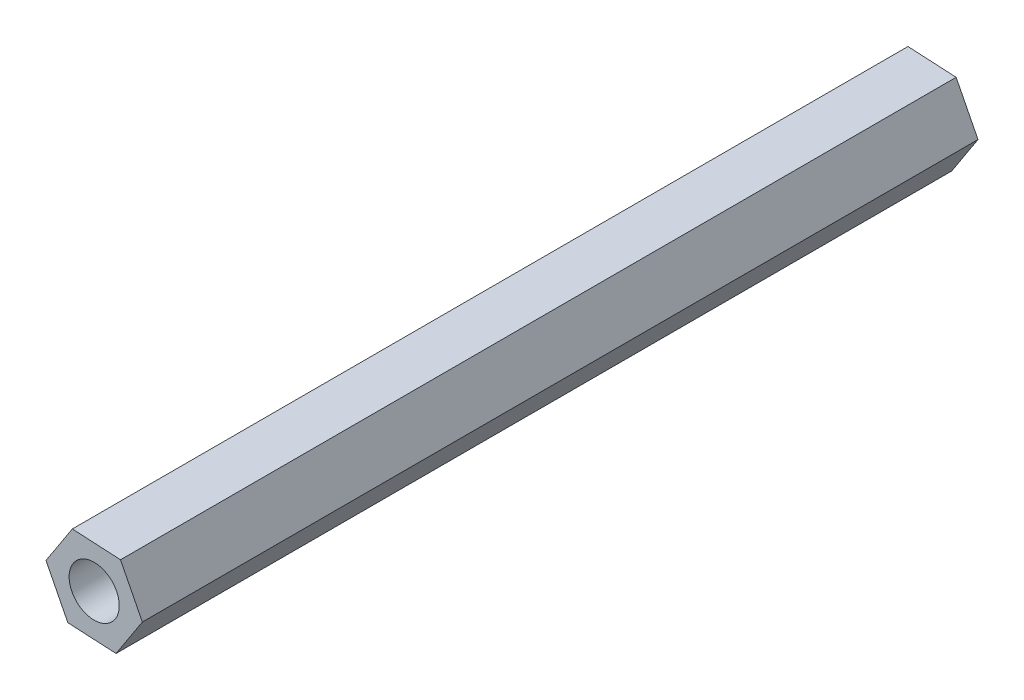
ISO-10303-21;
HEADER;
FILE_DESCRIPTION(('STEP AP214'),'2;1');
FILE_NAME('part.step','',(''),(''),'','','');
FILE_SCHEMA(('AUTOMOTIVE_DESIGN { 1 0 10303 214 1 1 1 1 }'));
ENDSEC;
DATA;
#1=APPLICATION_CONTEXT('core data for automotive mechanical design processes');
#2=APPLICATION_PROTOCOL_DEFINITION('international standard','automotive_design',2000,#1);
#3=PRODUCT_CONTEXT('',#1,'mechanical');
#4=PRODUCT('Part','Part','',(#3));
#5=PRODUCT_RELATED_PRODUCT_CATEGORY('part','',(#4));
#6=PRODUCT_DEFINITION_FORMATION('','',#4);
#7=PRODUCT_DEFINITION_CONTEXT('part definition',#1,'design');
#8=PRODUCT_DEFINITION('design','',#6,#7);
#9=PRODUCT_DEFINITION_SHAPE('','',#8);
#10=(LENGTH_UNIT() NAMED_UNIT(*) SI_UNIT(.MILLI.,.METRE.));
#11=(NAMED_UNIT(*) PLANE_ANGLE_UNIT() SI_UNIT($,.RADIAN.));
#12=(NAMED_UNIT(*) SI_UNIT($,.STERADIAN.) SOLID_ANGLE_UNIT());
#13=UNCERTAINTY_MEASURE_WITH_UNIT(LENGTH_MEASURE(1.E-05),#10,'distance_accuracy_value','');
#14=(GEOMETRIC_REPRESENTATION_CONTEXT(3) GLOBAL_UNCERTAINTY_ASSIGNED_CONTEXT((#13)) GLOBAL_UNIT_ASSIGNED_CONTEXT((#10,
#11,#12)) REPRESENTATION_CONTEXT('',''));
#15=CARTESIAN_POINT('',(0.,0.,0.));
#16=DIRECTION('',(0.,0.,1.));
#17=DIRECTION('',(1.,0.,0.));
#18=AXIS2_PLACEMENT_3D('',#15,#16,#17);
#19=CARTESIAN_POINT('',(2.8825916016709,-0.154916078280261,50.));
#20=DIRECTION('',(-0.891609732350342,-0.452804687672456,0.));
#21=DIRECTION('',(0.452804687672456,-0.891609732350342,0.));
#22=AXIS2_PLACEMENT_3D('',#19,#20,#21);
#23=PLANE('',#22);
#24=DIRECTION('',(-0.452804687672456,0.891609732350342,0.));
#25=VECTOR('',#24,1.);
#26=CARTESIAN_POINT('',(2.8825916016709,-0.154916078280261,0.));
#27=LINE('',#26,#25);
#28=CARTESIAN_POINT('',(2.8825916016709,-0.154916078280261,0.));
#29=VERTEX_POINT('',#28);
#30=CARTESIAN_POINT('',(1.57545706008081,2.41893951664254,0.));
#31=VERTEX_POINT('',#30);
#32=EDGE_CURVE('E116',#29,#31,#27,.T.);
#33=ORIENTED_EDGE('',*,*,#32,.T.);
#34=DIRECTION('',(0.,0.,-1.));
#35=VECTOR('',#34,1.);
#36=CARTESIAN_POINT('',(1.57545706008081,2.41893951664254,50.));
#37=LINE('',#36,#35);
#38=CARTESIAN_POINT('',(1.57545706008081,2.41893951664254,50.));
#39=VERTEX_POINT('',#38);
#40=EDGE_CURVE('E11',#39,#31,#37,.T.);
#41=ORIENTED_EDGE('',*,*,#40,.F.);
#42=DIRECTION('',(-0.452804687672456,0.891609732350342,0.));
#43=VECTOR('',#42,1.);
#44=CARTESIAN_POINT('',(2.8825916016709,-0.154916078280261,50.));
#45=LINE('',#44,#43);
#46=CARTESIAN_POINT('',(2.8825916016709,-0.154916078280261,50.));
#47=VERTEX_POINT('',#46);
#48=EDGE_CURVE('E127',#47,#39,#45,.T.);
#49=ORIENTED_EDGE('',*,*,#48,.F.);
#50=DIRECTION('',(0.,0.,-1.));
#51=VECTOR('',#50,1.);
#52=CARTESIAN_POINT('',(2.8825916016709,-0.154916078280261,50.));
#53=LINE('',#52,#51);
#54=EDGE_CURVE('E112',#47,#29,#53,.T.);
#55=ORIENTED_EDGE('',*,*,#54,.T.);
#56=EDGE_LOOP('',(#33,#41,#49,#55));
#57=FACE_BOUND('',#56,.T.);
#58=ADVANCED_FACE('F32',(#57),#23,.F.);
#59=CARTESIAN_POINT('',(1.57545706008081,2.41893951664254,50.));
#60=DIRECTION('',(-0.0536645036981452,-0.998559022313069,0.));
#61=DIRECTION('',(0.998559022313069,-0.0536645036981453,0.));
#62=AXIS2_PLACEMENT_3D('',#59,#60,#61);
#63=PLANE('',#62);
#64=DIRECTION('',(-0.998559022313069,0.0536645036981452,0.));
#65=VECTOR('',#64,1.);
#66=CARTESIAN_POINT('',(1.57545706008081,2.41893951664254,0.));
#67=LINE('',#66,#65);
#68=CARTESIAN_POINT('',(-1.30713454159008,2.5738555949228,0.));
#69=VERTEX_POINT('',#68);
#70=EDGE_CURVE('E119',#31,#69,#67,.T.);
#71=ORIENTED_EDGE('',*,*,#70,.T.);
#72=DIRECTION('',(0.,0.,-1.));
#73=VECTOR('',#72,1.);
#74=CARTESIAN_POINT('',(-1.30713454159008,2.5738555949228,50.));
#75=LINE('',#74,#73);
#76=CARTESIAN_POINT('',(-1.30713454159008,2.5738555949228,50.));
#77=VERTEX_POINT('',#76);
#78=EDGE_CURVE('E40',#77,#69,#75,.T.);
#79=ORIENTED_EDGE('',*,*,#78,.F.);
#80=DIRECTION('',(-0.998559022313069,0.0536645036981452,0.));
#81=VECTOR('',#80,1.);
#82=CARTESIAN_POINT('',(1.57545706008081,2.41893951664254,50.));
#83=LINE('',#82,#81);
#84=EDGE_CURVE('E85',#39,#77,#83,.T.);
#85=ORIENTED_EDGE('',*,*,#84,.F.);
#86=ORIENTED_EDGE('',*,*,#40,.T.);
#87=EDGE_LOOP('',(#71,#79,#85,#86));
#88=FACE_BOUND('',#87,.T.);
#89=ADVANCED_FACE('F152',(#88),#63,.F.);
#90=CARTESIAN_POINT('',(-1.30713454159008,2.5738555949228,50.));
#91=DIRECTION('',(0.837945228652197,-0.545754334640612,0.));
#92=DIRECTION('',(0.545754334640612,0.837945228652197,0.));
#93=AXIS2_PLACEMENT_3D('',#90,#91,#92);
#94=PLANE('',#93);
#95=DIRECTION('',(-0.545754334640612,-0.837945228652197,0.));
#96=VECTOR('',#95,1.);
#97=CARTESIAN_POINT('',(-1.30713454159008,2.5738555949228,0.));
#98=LINE('',#97,#96);
#99=CARTESIAN_POINT('',(-2.88259160167089,0.154916078280261,0.));
#100=VERTEX_POINT('',#99);
#101=EDGE_CURVE('E122',#69,#100,#98,.T.);
#102=ORIENTED_EDGE('',*,*,#101,.T.);
#103=DIRECTION('',(0.,0.,-1.));
#104=VECTOR('',#103,1.);
#105=CARTESIAN_POINT('',(-2.88259160167089,0.154916078280261,50.));
#106=LINE('',#105,#104);
#107=CARTESIAN_POINT('',(-2.88259160167089,0.154916078280261,50.));
#108=VERTEX_POINT('',#107);
#109=EDGE_CURVE('E107',#108,#100,#106,.T.);
#110=ORIENTED_EDGE('',*,*,#109,.F.);
#111=DIRECTION('',(-0.545754334640612,-0.837945228652197,0.));
#112=VECTOR('',#111,1.);
#113=CARTESIAN_POINT('',(-1.30713454159008,2.5738555949228,50.));
#114=LINE('',#113,#112);
#115=EDGE_CURVE('E98',#77,#108,#114,.T.);
#116=ORIENTED_EDGE('',*,*,#115,.F.);
#117=ORIENTED_EDGE('',*,*,#78,.T.);
#118=EDGE_LOOP('',(#102,#110,#116,#117));
#119=FACE_BOUND('',#118,.T.);
#120=ADVANCED_FACE('F133',(#119),#94,.F.);
#121=CARTESIAN_POINT('',(-2.88259160167089,0.154916078280261,50.));
#122=DIRECTION('',(0.891609732350343,0.452804687672456,0.));
#123=DIRECTION('',(-0.452804687672456,0.891609732350343,0.));
#124=AXIS2_PLACEMENT_3D('',#121,#122,#123);
#125=PLANE('',#124);
#126=DIRECTION('',(0.452804687672456,-0.891609732350343,0.));
#127=VECTOR('',#126,1.);
#128=CARTESIAN_POINT('',(-2.88259160167089,0.154916078280261,0.));
#129=LINE('',#128,#127);
#130=CARTESIAN_POINT('',(-1.57545706008081,-2.41893951664254,0.));
#131=VERTEX_POINT('',#130);
#132=EDGE_CURVE('E106',#100,#131,#129,.T.);
#133=ORIENTED_EDGE('',*,*,#132,.T.);
#134=DIRECTION('',(0.,0.,-1.));
#135=VECTOR('',#134,1.);
#136=CARTESIAN_POINT('',(-1.57545706008081,-2.41893951664254,50.));
#137=LINE('',#136,#135);
#138=CARTESIAN_POINT('',(-1.57545706008081,-2.41893951664254,50.));
#139=VERTEX_POINT('',#138);
#140=EDGE_CURVE('E103',#139,#131,#137,.T.);
#141=ORIENTED_EDGE('',*,*,#140,.F.);
#142=DIRECTION('',(0.452804687672456,-0.891609732350343,0.));
#143=VECTOR('',#142,1.);
#144=CARTESIAN_POINT('',(-2.88259160167089,0.154916078280261,50.));
#145=LINE('',#144,#143);
#146=EDGE_CURVE('E92',#108,#139,#145,.T.);
#147=ORIENTED_EDGE('',*,*,#146,.F.);
#148=ORIENTED_EDGE('',*,*,#109,.T.);
#149=EDGE_LOOP('',(#133,#141,#147,#148));
#150=FACE_BOUND('',#149,.T.);
#151=ADVANCED_FACE('F104',(#150),#125,.F.);
#152=CARTESIAN_POINT('',(-1.57545706008081,-2.41893951664254,50.));
#153=DIRECTION('',(0.0536645036981452,0.998559022313069,0.));
#154=DIRECTION('',(-0.998559022313069,0.0536645036981452,0.));
#155=AXIS2_PLACEMENT_3D('',#152,#153,#154);
#156=PLANE('',#155);
#157=DIRECTION('',(0.998559022313069,-0.0536645036981452,0.));
#158=VECTOR('',#157,1.);
#159=CARTESIAN_POINT('',(-1.57545706008081,-2.41893951664254,0.));
#160=LINE('',#159,#158);
#161=CARTESIAN_POINT('',(1.30713454159009,-2.5738555949228,0.));
#162=VERTEX_POINT('',#161);
#163=EDGE_CURVE('E71',#131,#162,#160,.T.);
#164=ORIENTED_EDGE('',*,*,#163,.T.);
#165=DIRECTION('',(0.,0.,-1.));
#166=VECTOR('',#165,1.);
#167=CARTESIAN_POINT('',(1.30713454159009,-2.5738555949228,50.));
#168=LINE('',#167,#166);
#169=CARTESIAN_POINT('',(1.30713454159009,-2.5738555949228,50.));
#170=VERTEX_POINT('',#169);
#171=EDGE_CURVE('E108',#170,#162,#168,.T.);
#172=ORIENTED_EDGE('',*,*,#171,.F.);
#173=DIRECTION('',(0.998559022313069,-0.0536645036981452,0.));
#174=VECTOR('',#173,1.);
#175=CARTESIAN_POINT('',(-1.57545706008081,-2.41893951664254,50.));
#176=LINE('',#175,#174);
#177=EDGE_CURVE('E96',#139,#170,#176,.T.);
#178=ORIENTED_EDGE('',*,*,#177,.F.);
#179=ORIENTED_EDGE('',*,*,#140,.T.);
#180=EDGE_LOOP('',(#164,#172,#178,#179));
#181=FACE_BOUND('',#180,.T.);
#182=ADVANCED_FACE('F110',(#181),#156,.F.);
#183=CARTESIAN_POINT('',(1.30713454159009,-2.5738555949228,50.));
#184=DIRECTION('',(-0.837945228652197,0.545754334640612,0.));
#185=DIRECTION('',(-0.545754334640612,-0.837945228652197,0.));
#186=AXIS2_PLACEMENT_3D('',#183,#184,#185);
#187=PLANE('',#186);
#188=DIRECTION('',(0.545754334640612,0.837945228652197,0.));
#189=VECTOR('',#188,1.);
#190=CARTESIAN_POINT('',(1.30713454159009,-2.5738555949228,0.));
#191=LINE('',#190,#189);
#192=EDGE_CURVE('E77',#162,#29,#191,.T.);
#193=ORIENTED_EDGE('',*,*,#192,.T.);
#194=ORIENTED_EDGE('',*,*,#54,.F.);
#195=DIRECTION('',(0.545754334640612,0.837945228652197,0.));
#196=VECTOR('',#195,1.);
#197=CARTESIAN_POINT('',(1.30713454159009,-2.5738555949228,50.));
#198=LINE('',#197,#196);
#199=EDGE_CURVE('E48',#170,#47,#198,.T.);
#200=ORIENTED_EDGE('',*,*,#199,.F.);
#201=ORIENTED_EDGE('',*,*,#171,.T.);
#202=EDGE_LOOP('',(#193,#194,#200,#201));
#203=FACE_BOUND('',#202,.T.);
#204=ADVANCED_FACE('F140',(#203),#187,.F.);
#205=CARTESIAN_POINT('',(1.57545706008081,2.41893951664254,50.));
#206=DIRECTION('',(0.,0.,1.));
#207=DIRECTION('',(1.,0.,0.));
#208=AXIS2_PLACEMENT_3D('',#205,#206,#207);
#209=PLANE('',#208);
#210=CARTESIAN_POINT('',(0.,0.,50.));
#211=DIRECTION('',(0.,0.,-1.));
#212=DIRECTION('',(-1.,0.,0.));
#213=AXIS2_PLACEMENT_3D('',#210,#211,#212);
#214=CIRCLE('',#213,1.5);
#215=CARTESIAN_POINT('',(-1.5,0.,50.));
#216=VERTEX_POINT('',#215);
#217=EDGE_CURVE('E120',#216,#216,#214,.T.);
#218=ORIENTED_EDGE('',*,*,#217,.T.);
#219=EDGE_LOOP('',(#218));
#220=FACE_BOUND('',#219,.T.);
#221=ORIENTED_EDGE('',*,*,#48,.T.);
#222=ORIENTED_EDGE('',*,*,#84,.T.);
#223=ORIENTED_EDGE('',*,*,#115,.T.);
#224=ORIENTED_EDGE('',*,*,#146,.T.);
#225=ORIENTED_EDGE('',*,*,#177,.T.);
#226=ORIENTED_EDGE('',*,*,#199,.T.);
#227=EDGE_LOOP('',(#221,#222,#223,#224,#225,#226));
#228=FACE_BOUND('',#227,.T.);
#229=ADVANCED_FACE('F94',(#220,#228),#209,.T.);
#230=CARTESIAN_POINT('',(1.57545706008081,2.41893951664254,0.));
#231=DIRECTION('',(0.,0.,1.));
#232=DIRECTION('',(1.,0.,0.));
#233=AXIS2_PLACEMENT_3D('',#230,#231,#232);
#234=PLANE('',#233);
#235=CARTESIAN_POINT('',(0.,0.,0.));
#236=DIRECTION('',(0.,0.,-1.));
#237=DIRECTION('',(-1.,0.,0.));
#238=AXIS2_PLACEMENT_3D('',#235,#236,#237);
#239=CIRCLE('',#238,1.5);
#240=CARTESIAN_POINT('',(-1.5,0.,0.));
#241=VERTEX_POINT('',#240);
#242=EDGE_CURVE('E207',#241,#241,#239,.T.);
#243=ORIENTED_EDGE('',*,*,#242,.F.);
#244=EDGE_LOOP('',(#243));
#245=FACE_BOUND('',#244,.T.);
#246=ORIENTED_EDGE('',*,*,#32,.F.);
#247=ORIENTED_EDGE('',*,*,#192,.F.);
#248=ORIENTED_EDGE('',*,*,#163,.F.);
#249=ORIENTED_EDGE('',*,*,#132,.F.);
#250=ORIENTED_EDGE('',*,*,#101,.F.);
#251=ORIENTED_EDGE('',*,*,#70,.F.);
#252=EDGE_LOOP('',(#246,#247,#248,#249,#250,#251));
#253=FACE_BOUND('',#252,.T.);
#254=ADVANCED_FACE('F136',(#245,#253),#234,.F.);
#255=CARTESIAN_POINT('',(0.,0.,50.));
#256=DIRECTION('',(0.,0.,-1.));
#257=DIRECTION('',(-1.,0.,0.));
#258=AXIS2_PLACEMENT_3D('',#255,#256,#257);
#259=CYLINDRICAL_SURFACE('',#258,1.5);
#260=ORIENTED_EDGE('',*,*,#217,.F.);
#261=EDGE_LOOP('',(#260));
#262=FACE_BOUND('',#261,.T.);
#263=ORIENTED_EDGE('',*,*,#242,.T.);
#264=EDGE_LOOP('',(#263));
#265=FACE_BOUND('',#264,.T.);
#266=ADVANCED_FACE('F189',(#262,#265),#259,.F.);
#267=CLOSED_SHELL('',(#58,#89,#120,#151,#182,#204,#229,#254,#266));
#268=MANIFOLD_SOLID_BREP('B2',#267);
#269=ADVANCED_BREP_SHAPE_REPRESENTATION('',(#18,#268),#14);
#270=SHAPE_DEFINITION_REPRESENTATION(#9,#269);
ENDSEC;
END-ISO-10303-21;
